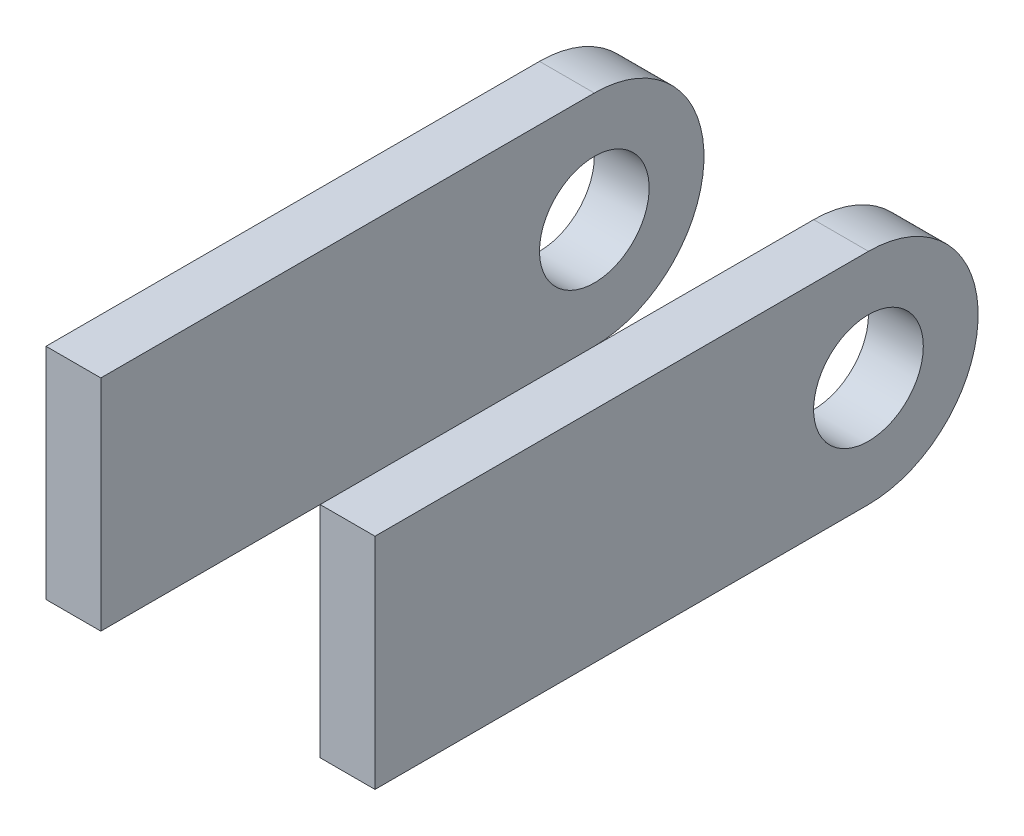
ISO-10303-21;
HEADER;
FILE_DESCRIPTION(('STEP AP214'),'2;1');
FILE_NAME('part.step','',(''),(''),'','','');
FILE_SCHEMA(('AUTOMOTIVE_DESIGN { 1 0 10303 214 1 1 1 1 }'));
ENDSEC;
DATA;
#1=APPLICATION_CONTEXT('core data for automotive mechanical design processes');
#2=APPLICATION_PROTOCOL_DEFINITION('international standard','automotive_design',2000,#1);
#3=PRODUCT_CONTEXT('',#1,'mechanical');
#4=PRODUCT('Part','Part','',(#3));
#5=PRODUCT_RELATED_PRODUCT_CATEGORY('part','',(#4));
#6=PRODUCT_DEFINITION_FORMATION('','',#4);
#7=PRODUCT_DEFINITION_CONTEXT('part definition',#1,'design');
#8=PRODUCT_DEFINITION('design','',#6,#7);
#9=PRODUCT_DEFINITION_SHAPE('','',#8);
#10=(LENGTH_UNIT() NAMED_UNIT(*) SI_UNIT(.MILLI.,.METRE.));
#11=(NAMED_UNIT(*) PLANE_ANGLE_UNIT() SI_UNIT($,.RADIAN.));
#12=(NAMED_UNIT(*) SI_UNIT($,.STERADIAN.) SOLID_ANGLE_UNIT());
#13=UNCERTAINTY_MEASURE_WITH_UNIT(LENGTH_MEASURE(1.E-05),#10,'distance_accuracy_value','');
#14=(GEOMETRIC_REPRESENTATION_CONTEXT(3) GLOBAL_UNCERTAINTY_ASSIGNED_CONTEXT((#13)) GLOBAL_UNIT_ASSIGNED_CONTEXT((#10,
#11,#12)) REPRESENTATION_CONTEXT('',''));
#15=CARTESIAN_POINT('',(0.,0.,0.));
#16=DIRECTION('',(0.,0.,1.));
#17=DIRECTION('',(1.,0.,0.));
#18=AXIS2_PLACEMENT_3D('',#15,#16,#17);
#19=CARTESIAN_POINT('',(30.,0.,0.));
#20=DIRECTION('',(-1.,0.,0.));
#21=DIRECTION('',(0.,0.,1.));
#22=AXIS2_PLACEMENT_3D('',#19,#20,#21);
#23=CYLINDRICAL_SURFACE('',#22,10.);
#24=DIRECTION('',(-1.,0.,0.));
#25=VECTOR('',#24,1.);
#26=CARTESIAN_POINT('',(30.,-10.,0.));
#27=LINE('',#26,#25);
#28=CARTESIAN_POINT('',(30.,-10.,0.));
#29=VERTEX_POINT('',#28);
#30=CARTESIAN_POINT('',(25.,-10.,0.));
#31=VERTEX_POINT('',#30);
#32=EDGE_CURVE('E53',#29,#31,#27,.T.);
#33=ORIENTED_EDGE('',*,*,#32,.T.);
#34=CARTESIAN_POINT('',(25.,0.,0.));
#35=DIRECTION('',(1.,0.,0.));
#36=DIRECTION('',(0.,0.,-1.));
#37=AXIS2_PLACEMENT_3D('',#34,#35,#36);
#38=CIRCLE('',#37,10.);
#39=CARTESIAN_POINT('',(25.,10.,0.));
#40=VERTEX_POINT('',#39);
#41=EDGE_CURVE('E69',#31,#40,#38,.T.);
#42=ORIENTED_EDGE('',*,*,#41,.T.);
#43=DIRECTION('',(-1.,0.,0.));
#44=VECTOR('',#43,1.);
#45=CARTESIAN_POINT('',(30.,10.,0.));
#46=LINE('',#45,#44);
#47=CARTESIAN_POINT('',(30.,10.,0.));
#48=VERTEX_POINT('',#47);
#49=EDGE_CURVE('E100',#48,#40,#46,.T.);
#50=ORIENTED_EDGE('',*,*,#49,.F.);
#51=CARTESIAN_POINT('',(30.,0.,0.));
#52=DIRECTION('',(1.,0.,0.));
#53=DIRECTION('',(0.,0.,-1.));
#54=AXIS2_PLACEMENT_3D('',#51,#52,#53);
#55=CIRCLE('',#54,10.);
#56=EDGE_CURVE('E121',#29,#48,#55,.T.);
#57=ORIENTED_EDGE('',*,*,#56,.F.);
#58=EDGE_LOOP('',(#33,#42,#50,#57));
#59=FACE_BOUND('',#58,.T.);
#60=ADVANCED_FACE('F49',(#59),#23,.T.);
#61=CARTESIAN_POINT('',(30.,10.,0.));
#62=DIRECTION('',(0.,-1.,0.));
#63=DIRECTION('',(0.,0.,-1.));
#64=AXIS2_PLACEMENT_3D('',#61,#62,#63);
#65=PLANE('',#64);
#66=ORIENTED_EDGE('',*,*,#49,.T.);
#67=DIRECTION('',(0.,0.,1.));
#68=VECTOR('',#67,1.);
#69=CARTESIAN_POINT('',(25.,10.,-20.));
#70=LINE('',#69,#68);
#71=CARTESIAN_POINT('',(25.,10.,45.));
#72=VERTEX_POINT('',#71);
#73=EDGE_CURVE('E88',#40,#72,#70,.T.);
#74=ORIENTED_EDGE('',*,*,#73,.T.);
#75=DIRECTION('',(-1.,0.,0.));
#76=VECTOR('',#75,1.);
#77=CARTESIAN_POINT('',(30.,10.,45.));
#78=LINE('',#77,#76);
#79=CARTESIAN_POINT('',(30.,10.,45.));
#80=VERTEX_POINT('',#79);
#81=EDGE_CURVE('E97',#80,#72,#78,.T.);
#82=ORIENTED_EDGE('',*,*,#81,.F.);
#83=DIRECTION('',(0.,0.,1.));
#84=VECTOR('',#83,1.);
#85=CARTESIAN_POINT('',(30.,10.,0.));
#86=LINE('',#85,#84);
#87=EDGE_CURVE('E125',#48,#80,#86,.T.);
#88=ORIENTED_EDGE('',*,*,#87,.F.);
#89=EDGE_LOOP('',(#66,#74,#82,#88));
#90=FACE_BOUND('',#89,.T.);
#91=ADVANCED_FACE('F96',(#90),#65,.F.);
#92=CARTESIAN_POINT('',(30.,10.,45.));
#93=DIRECTION('',(0.,0.,-1.));
#94=DIRECTION('',(-1.,0.,0.));
#95=AXIS2_PLACEMENT_3D('',#92,#93,#94);
#96=PLANE('',#95);
#97=ORIENTED_EDGE('',*,*,#81,.T.);
#98=DIRECTION('',(0.,1.,0.));
#99=VECTOR('',#98,1.);
#100=CARTESIAN_POINT('',(25.,10.,45.));
#101=LINE('',#100,#99);
#102=CARTESIAN_POINT('',(25.,-9.99999999999999,45.));
#103=VERTEX_POINT('',#102);
#104=EDGE_CURVE('E12',#103,#72,#101,.T.);
#105=ORIENTED_EDGE('',*,*,#104,.F.);
#106=DIRECTION('',(-1.,0.,0.));
#107=VECTOR('',#106,1.);
#108=CARTESIAN_POINT('',(30.,-10.,45.));
#109=LINE('',#108,#107);
#110=CARTESIAN_POINT('',(30.,-10.,45.));
#111=VERTEX_POINT('',#110);
#112=EDGE_CURVE('E106',#111,#103,#109,.T.);
#113=ORIENTED_EDGE('',*,*,#112,.F.);
#114=DIRECTION('',(0.,-1.,0.));
#115=VECTOR('',#114,1.);
#116=CARTESIAN_POINT('',(30.,10.,45.));
#117=LINE('',#116,#115);
#118=EDGE_CURVE('E104',#80,#111,#117,.T.);
#119=ORIENTED_EDGE('',*,*,#118,.F.);
#120=EDGE_LOOP('',(#97,#105,#113,#119));
#121=FACE_BOUND('',#120,.T.);
#122=ADVANCED_FACE('F103',(#121),#96,.F.);
#123=CARTESIAN_POINT('',(30.,-10.,45.));
#124=DIRECTION('',(0.,1.,0.));
#125=DIRECTION('',(0.,0.,1.));
#126=AXIS2_PLACEMENT_3D('',#123,#124,#125);
#127=PLANE('',#126);
#128=ORIENTED_EDGE('',*,*,#112,.T.);
#129=DIRECTION('',(0.,0.,1.));
#130=VECTOR('',#129,1.);
#131=CARTESIAN_POINT('',(25.,-9.99999999999999,-20.));
#132=LINE('',#131,#130);
#133=EDGE_CURVE('E60',#31,#103,#132,.T.);
#134=ORIENTED_EDGE('',*,*,#133,.F.);
#135=ORIENTED_EDGE('',*,*,#32,.F.);
#136=DIRECTION('',(0.,0.,-1.));
#137=VECTOR('',#136,1.);
#138=CARTESIAN_POINT('',(30.,-10.,45.));
#139=LINE('',#138,#137);
#140=EDGE_CURVE('E130',#111,#29,#139,.T.);
#141=ORIENTED_EDGE('',*,*,#140,.F.);
#142=EDGE_LOOP('',(#128,#134,#135,#141));
#143=FACE_BOUND('',#142,.T.);
#144=ADVANCED_FACE('F141',(#143),#127,.F.);
#145=CARTESIAN_POINT('',(30.,0.,0.));
#146=DIRECTION('',(-1.,0.,0.));
#147=DIRECTION('',(0.,0.,1.));
#148=AXIS2_PLACEMENT_3D('',#145,#146,#147);
#149=CYLINDRICAL_SURFACE('',#148,4.99999999999999);
#150=CARTESIAN_POINT('',(25.,0.,0.));
#151=DIRECTION('',(1.,0.,0.));
#152=DIRECTION('',(0.,0.,-1.));
#153=AXIS2_PLACEMENT_3D('',#150,#151,#152);
#154=CIRCLE('',#153,4.99999999999999);
#155=CARTESIAN_POINT('',(25.,0.,-4.99999999999999));
#156=VERTEX_POINT('',#155);
#157=EDGE_CURVE('E114',#156,#156,#154,.T.);
#158=ORIENTED_EDGE('',*,*,#157,.F.);
#159=EDGE_LOOP('',(#158));
#160=FACE_BOUND('',#159,.T.);
#161=CARTESIAN_POINT('',(30.,0.,0.));
#162=DIRECTION('',(1.,0.,0.));
#163=DIRECTION('',(0.,0.,-1.));
#164=AXIS2_PLACEMENT_3D('',#161,#162,#163);
#165=CIRCLE('',#164,4.99999999999999);
#166=CARTESIAN_POINT('',(30.,0.,-4.99999999999999));
#167=VERTEX_POINT('',#166);
#168=EDGE_CURVE('E109',#167,#167,#165,.T.);
#169=ORIENTED_EDGE('',*,*,#168,.T.);
#170=EDGE_LOOP('',(#169));
#171=FACE_BOUND('',#170,.T.);
#172=ADVANCED_FACE('F51',(#160,#171),#149,.F.);
#173=CARTESIAN_POINT('',(30.,0.,0.));
#174=DIRECTION('',(1.,0.,0.));
#175=DIRECTION('',(0.,0.,-1.));
#176=AXIS2_PLACEMENT_3D('',#173,#174,#175);
#177=PLANE('',#176);
#178=ORIENTED_EDGE('',*,*,#56,.T.);
#179=ORIENTED_EDGE('',*,*,#87,.T.);
#180=ORIENTED_EDGE('',*,*,#118,.T.);
#181=ORIENTED_EDGE('',*,*,#140,.T.);
#182=EDGE_LOOP('',(#178,#179,#180,#181));
#183=FACE_BOUND('',#182,.T.);
#184=ORIENTED_EDGE('',*,*,#168,.F.);
#185=EDGE_LOOP('',(#184));
#186=FACE_BOUND('',#185,.T.);
#187=ADVANCED_FACE('F140',(#183,#186),#177,.T.);
#188=CARTESIAN_POINT('',(25.,10.,-20.));
#189=DIRECTION('',(1.,0.,0.));
#190=DIRECTION('',(0.,0.,-1.));
#191=AXIS2_PLACEMENT_3D('',#188,#189,#190);
#192=PLANE('',#191);
#193=ORIENTED_EDGE('',*,*,#157,.T.);
#194=EDGE_LOOP('',(#193));
#195=FACE_BOUND('',#194,.T.);
#196=ORIENTED_EDGE('',*,*,#133,.T.);
#197=ORIENTED_EDGE('',*,*,#104,.T.);
#198=ORIENTED_EDGE('',*,*,#73,.F.);
#199=ORIENTED_EDGE('',*,*,#41,.F.);
#200=EDGE_LOOP('',(#196,#197,#198,#199));
#201=FACE_BOUND('',#200,.T.);
#202=ADVANCED_FACE('F87',(#195,#201),#192,.F.);
#203=CLOSED_SHELL('',(#60,#91,#122,#144,#172,#187,#202));
#204=MANIFOLD_SOLID_BREP('B2',#203);
#205=CARTESIAN_POINT('',(30.,-10.,45.));
#206=DIRECTION('',(0.,1.,0.));
#207=DIRECTION('',(0.,0.,1.));
#208=AXIS2_PLACEMENT_3D('',#205,#206,#207);
#209=PLANE('',#208);
#210=DIRECTION('',(-1.,0.,0.));
#211=VECTOR('',#210,1.);
#212=CARTESIAN_POINT('',(30.,-10.,0.));
#213=LINE('',#212,#211);
#214=CARTESIAN_POINT('',(5.,-9.99999999999999,0.));
#215=VERTEX_POINT('',#214);
#216=CARTESIAN_POINT('',(0.,-10.,0.));
#217=VERTEX_POINT('',#216);
#218=EDGE_CURVE('E232',#215,#217,#213,.T.);
#219=ORIENTED_EDGE('',*,*,#218,.F.);
#220=DIRECTION('',(0.,0.,1.));
#221=VECTOR('',#220,1.);
#222=CARTESIAN_POINT('',(5.,-9.99999999999999,-20.));
#223=LINE('',#222,#221);
#224=CARTESIAN_POINT('',(5.,-10.,45.));
#225=VERTEX_POINT('',#224);
#226=EDGE_CURVE('E255',#215,#225,#223,.T.);
#227=ORIENTED_EDGE('',*,*,#226,.T.);
#228=DIRECTION('',(-1.,0.,0.));
#229=VECTOR('',#228,1.);
#230=CARTESIAN_POINT('',(30.,-10.,45.));
#231=LINE('',#230,#229);
#232=CARTESIAN_POINT('',(0.,-10.,45.));
#233=VERTEX_POINT('',#232);
#234=EDGE_CURVE('E262',#225,#233,#231,.T.);
#235=ORIENTED_EDGE('',*,*,#234,.T.);
#236=DIRECTION('',(0.,0.,-1.));
#237=VECTOR('',#236,1.);
#238=CARTESIAN_POINT('',(0.,-10.,45.));
#239=LINE('',#238,#237);
#240=EDGE_CURVE('E272',#233,#217,#239,.T.);
#241=ORIENTED_EDGE('',*,*,#240,.T.);
#242=EDGE_LOOP('',(#219,#227,#235,#241));
#243=FACE_BOUND('',#242,.T.);
#244=ADVANCED_FACE('F208',(#243),#209,.F.);
#245=CARTESIAN_POINT('',(30.,10.,45.));
#246=DIRECTION('',(0.,0.,-1.));
#247=DIRECTION('',(-1.,0.,0.));
#248=AXIS2_PLACEMENT_3D('',#245,#246,#247);
#249=PLANE('',#248);
#250=ORIENTED_EDGE('',*,*,#234,.F.);
#251=DIRECTION('',(0.,-1.,0.));
#252=VECTOR('',#251,1.);
#253=CARTESIAN_POINT('',(5.,10.,45.));
#254=LINE('',#253,#252);
#255=CARTESIAN_POINT('',(5.,10.,45.));
#256=VERTEX_POINT('',#255);
#257=EDGE_CURVE('E224',#256,#225,#254,.T.);
#258=ORIENTED_EDGE('',*,*,#257,.F.);
#259=DIRECTION('',(-1.,0.,0.));
#260=VECTOR('',#259,1.);
#261=CARTESIAN_POINT('',(30.,10.,45.));
#262=LINE('',#261,#260);
#263=CARTESIAN_POINT('',(0.,10.,45.));
#264=VERTEX_POINT('',#263);
#265=EDGE_CURVE('E217',#256,#264,#262,.T.);
#266=ORIENTED_EDGE('',*,*,#265,.T.);
#267=DIRECTION('',(0.,-1.,0.));
#268=VECTOR('',#267,1.);
#269=CARTESIAN_POINT('',(0.,10.,45.));
#270=LINE('',#269,#268);
#271=EDGE_CURVE('E274',#264,#233,#270,.T.);
#272=ORIENTED_EDGE('',*,*,#271,.T.);
#273=EDGE_LOOP('',(#250,#258,#266,#272));
#274=FACE_BOUND('',#273,.T.);
#275=ADVANCED_FACE('F259',(#274),#249,.F.);
#276=CARTESIAN_POINT('',(30.,10.,0.));
#277=DIRECTION('',(0.,-1.,0.));
#278=DIRECTION('',(0.,0.,-1.));
#279=AXIS2_PLACEMENT_3D('',#276,#277,#278);
#280=PLANE('',#279);
#281=ORIENTED_EDGE('',*,*,#265,.F.);
#282=DIRECTION('',(0.,0.,1.));
#283=VECTOR('',#282,1.);
#284=CARTESIAN_POINT('',(5.,10.,-20.));
#285=LINE('',#284,#283);
#286=CARTESIAN_POINT('',(5.,10.,0.));
#287=VERTEX_POINT('',#286);
#288=EDGE_CURVE('E249',#287,#256,#285,.T.);
#289=ORIENTED_EDGE('',*,*,#288,.F.);
#290=DIRECTION('',(-1.,0.,0.));
#291=VECTOR('',#290,1.);
#292=CARTESIAN_POINT('',(30.,10.,0.));
#293=LINE('',#292,#291);
#294=CARTESIAN_POINT('',(0.,10.,0.));
#295=VERTEX_POINT('',#294);
#296=EDGE_CURVE('E47',#287,#295,#293,.T.);
#297=ORIENTED_EDGE('',*,*,#296,.T.);
#298=DIRECTION('',(0.,0.,1.));
#299=VECTOR('',#298,1.);
#300=CARTESIAN_POINT('',(0.,10.,0.));
#301=LINE('',#300,#299);
#302=EDGE_CURVE('E266',#295,#264,#301,.T.);
#303=ORIENTED_EDGE('',*,*,#302,.T.);
#304=EDGE_LOOP('',(#281,#289,#297,#303));
#305=FACE_BOUND('',#304,.T.);
#306=ADVANCED_FACE('F264',(#305),#280,.F.);
#307=CARTESIAN_POINT('',(30.,0.,0.));
#308=DIRECTION('',(-1.,0.,0.));
#309=DIRECTION('',(0.,0.,1.));
#310=AXIS2_PLACEMENT_3D('',#307,#308,#309);
#311=CYLINDRICAL_SURFACE('',#310,10.);
#312=ORIENTED_EDGE('',*,*,#296,.F.);
#313=CARTESIAN_POINT('',(5.,0.,0.));
#314=DIRECTION('',(-1.,0.,0.));
#315=DIRECTION('',(0.,0.,1.));
#316=AXIS2_PLACEMENT_3D('',#313,#314,#315);
#317=CIRCLE('',#316,10.);
#318=EDGE_CURVE('E251',#287,#215,#317,.T.);
#319=ORIENTED_EDGE('',*,*,#318,.T.);
#320=ORIENTED_EDGE('',*,*,#218,.T.);
#321=CARTESIAN_POINT('',(0.,0.,0.));
#322=DIRECTION('',(1.,0.,0.));
#323=DIRECTION('',(0.,0.,-1.));
#324=AXIS2_PLACEMENT_3D('',#321,#322,#323);
#325=CIRCLE('',#324,10.);
#326=EDGE_CURVE('E277',#217,#295,#325,.T.);
#327=ORIENTED_EDGE('',*,*,#326,.T.);
#328=EDGE_LOOP('',(#312,#319,#320,#327));
#329=FACE_BOUND('',#328,.T.);
#330=ADVANCED_FACE('F210',(#329),#311,.T.);
#331=CARTESIAN_POINT('',(0.,0.,0.));
#332=DIRECTION('',(1.,0.,0.));
#333=DIRECTION('',(0.,0.,-1.));
#334=AXIS2_PLACEMENT_3D('',#331,#332,#333);
#335=PLANE('',#334);
#336=ORIENTED_EDGE('',*,*,#326,.F.);
#337=ORIENTED_EDGE('',*,*,#240,.F.);
#338=ORIENTED_EDGE('',*,*,#271,.F.);
#339=ORIENTED_EDGE('',*,*,#302,.F.);
#340=EDGE_LOOP('',(#336,#337,#338,#339));
#341=FACE_BOUND('',#340,.T.);
#342=CARTESIAN_POINT('',(0.,0.,0.));
#343=DIRECTION('',(1.,0.,0.));
#344=DIRECTION('',(0.,0.,-1.));
#345=AXIS2_PLACEMENT_3D('',#342,#343,#344);
#346=CIRCLE('',#345,4.99999999999999);
#347=CARTESIAN_POINT('',(0.,0.,-4.99999999999999));
#348=VERTEX_POINT('',#347);
#349=EDGE_CURVE('E279',#348,#348,#346,.T.);
#350=ORIENTED_EDGE('',*,*,#349,.T.);
#351=EDGE_LOOP('',(#350));
#352=FACE_BOUND('',#351,.T.);
#353=ADVANCED_FACE('F291',(#341,#352),#335,.F.);
#354=CARTESIAN_POINT('',(30.,0.,0.));
#355=DIRECTION('',(-1.,0.,0.));
#356=DIRECTION('',(0.,0.,1.));
#357=AXIS2_PLACEMENT_3D('',#354,#355,#356);
#358=CYLINDRICAL_SURFACE('',#357,4.99999999999999);
#359=CARTESIAN_POINT('',(5.,0.,0.));
#360=DIRECTION('',(-1.,0.,0.));
#361=DIRECTION('',(0.,0.,1.));
#362=AXIS2_PLACEMENT_3D('',#359,#360,#361);
#363=CIRCLE('',#362,4.99999999999999);
#364=CARTESIAN_POINT('',(5.,0.,4.99999999999999));
#365=VERTEX_POINT('',#364);
#366=EDGE_CURVE('E212',#365,#365,#363,.T.);
#367=ORIENTED_EDGE('',*,*,#366,.F.);
#368=EDGE_LOOP('',(#367));
#369=FACE_BOUND('',#368,.T.);
#370=ORIENTED_EDGE('',*,*,#349,.F.);
#371=EDGE_LOOP('',(#370));
#372=FACE_BOUND('',#371,.T.);
#373=ADVANCED_FACE('F288',(#369,#372),#358,.F.);
#374=CARTESIAN_POINT('',(5.,10.,-20.));
#375=DIRECTION('',(-1.,0.,0.));
#376=DIRECTION('',(0.,0.,1.));
#377=AXIS2_PLACEMENT_3D('',#374,#375,#376);
#378=PLANE('',#377);
#379=ORIENTED_EDGE('',*,*,#366,.T.);
#380=EDGE_LOOP('',(#379));
#381=FACE_BOUND('',#380,.T.);
#382=ORIENTED_EDGE('',*,*,#288,.T.);
#383=ORIENTED_EDGE('',*,*,#257,.T.);
#384=ORIENTED_EDGE('',*,*,#226,.F.);
#385=ORIENTED_EDGE('',*,*,#318,.F.);
#386=EDGE_LOOP('',(#382,#383,#384,#385));
#387=FACE_BOUND('',#386,.T.);
#388=ADVANCED_FACE('F250',(#381,#387),#378,.F.);
#389=CLOSED_SHELL('',(#244,#275,#306,#330,#353,#373,#388));
#390=MANIFOLD_SOLID_BREP('B6',#389);
#391=ADVANCED_BREP_SHAPE_REPRESENTATION('',(#18,#204,#390),#14);
#392=SHAPE_DEFINITION_REPRESENTATION(#9,#391);
ENDSEC;
END-ISO-10303-21;
